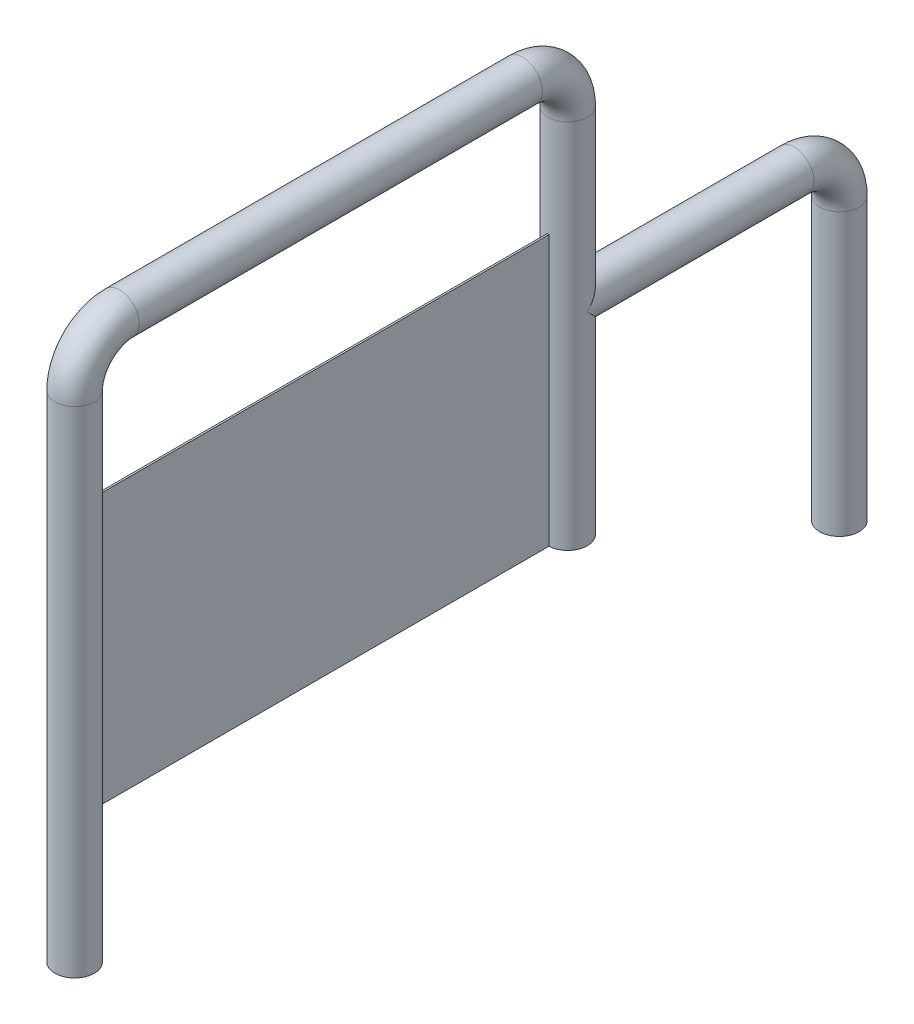
ISO-10303-21;
HEADER;
FILE_DESCRIPTION(('STEP AP214'),'2;1');
FILE_NAME('part.step','',(''),(''),'','','');
FILE_SCHEMA(('AUTOMOTIVE_DESIGN { 1 0 10303 214 1 1 1 1 }'));
ENDSEC;
DATA;
#1=APPLICATION_CONTEXT('core data for automotive mechanical design processes');
#2=APPLICATION_PROTOCOL_DEFINITION('international standard','automotive_design',2000,#1);
#3=PRODUCT_CONTEXT('',#1,'mechanical');
#4=PRODUCT('Part','Part','',(#3));
#5=PRODUCT_RELATED_PRODUCT_CATEGORY('part','',(#4));
#6=PRODUCT_DEFINITION_FORMATION('','',#4);
#7=PRODUCT_DEFINITION_CONTEXT('part definition',#1,'design');
#8=PRODUCT_DEFINITION('design','',#6,#7);
#9=PRODUCT_DEFINITION_SHAPE('','',#8);
#10=(LENGTH_UNIT() NAMED_UNIT(*) SI_UNIT(.MILLI.,.METRE.));
#11=(NAMED_UNIT(*) PLANE_ANGLE_UNIT() SI_UNIT($,.RADIAN.));
#12=(NAMED_UNIT(*) SI_UNIT($,.STERADIAN.) SOLID_ANGLE_UNIT());
#13=UNCERTAINTY_MEASURE_WITH_UNIT(LENGTH_MEASURE(1.E-05),#10,'distance_accuracy_value','');
#14=(GEOMETRIC_REPRESENTATION_CONTEXT(3) GLOBAL_UNCERTAINTY_ASSIGNED_CONTEXT((#13)) GLOBAL_UNIT_ASSIGNED_CONTEXT((#10,
#11,#12)) REPRESENTATION_CONTEXT('',''));
#15=CARTESIAN_POINT('',(0.,0.,0.));
#16=DIRECTION('',(0.,0.,1.));
#17=DIRECTION('',(1.,0.,0.));
#18=AXIS2_PLACEMENT_3D('',#15,#16,#17);
#19=CARTESIAN_POINT('',(-0.508,222.25,-11.1125));
#20=DIRECTION('',(0.,0.,1.));
#21=DIRECTION('',(0.,-1.,0.));
#22=AXIS2_PLACEMENT_3D('',#19,#20,#21);
#23=PLANE('',#22);
#24=DIRECTION('',(1.,0.,0.));
#25=VECTOR('',#24,1.);
#26=CARTESIAN_POINT('',(-0.508,69.85,-11.1125));
#27=LINE('',#26,#25);
#28=CARTESIAN_POINT('',(-0.508,69.85,-11.1125));
#29=VERTEX_POINT('',#28);
#30=CARTESIAN_POINT('',(0.508,69.85,-11.1125));
#31=VERTEX_POINT('',#30);
#32=EDGE_CURVE('E58',#29,#31,#27,.T.);
#33=ORIENTED_EDGE('',*,*,#32,.T.);
#34=DIRECTION('',(0.,-1.,0.));
#35=VECTOR('',#34,1.);
#36=CARTESIAN_POINT('',(0.508,222.25,-11.1125));
#37=LINE('',#36,#35);
#38=CARTESIAN_POINT('',(0.508,222.25,-11.1125));
#39=VERTEX_POINT('',#38);
#40=EDGE_CURVE('E95',#39,#31,#37,.T.);
#41=ORIENTED_EDGE('',*,*,#40,.F.);
#42=DIRECTION('',(1.,0.,0.));
#43=VECTOR('',#42,1.);
#44=CARTESIAN_POINT('',(-0.508,222.25,-11.1125));
#45=LINE('',#44,#43);
#46=CARTESIAN_POINT('',(-0.508,222.25,-11.1125));
#47=VERTEX_POINT('',#46);
#48=EDGE_CURVE('E13',#47,#39,#45,.T.);
#49=ORIENTED_EDGE('',*,*,#48,.F.);
#50=DIRECTION('',(0.,-1.,0.));
#51=VECTOR('',#50,1.);
#52=CARTESIAN_POINT('',(-0.508,222.25,-11.1125));
#53=LINE('',#52,#51);
#54=EDGE_CURVE('E96',#47,#29,#53,.T.);
#55=ORIENTED_EDGE('',*,*,#54,.T.);
#56=EDGE_LOOP('',(#33,#41,#49,#55));
#57=FACE_BOUND('',#56,.T.);
#58=ADVANCED_FACE('F55',(#57),#23,.T.);
#59=CARTESIAN_POINT('',(-0.508,222.25,-11.1125));
#60=DIRECTION('',(0.,1.,0.));
#61=DIRECTION('',(0.,0.,1.));
#62=AXIS2_PLACEMENT_3D('',#59,#60,#61);
#63=PLANE('',#62);
#64=ORIENTED_EDGE('',*,*,#48,.T.);
#65=DIRECTION('',(0.,0.,1.));
#66=VECTOR('',#65,1.);
#67=CARTESIAN_POINT('',(0.508,222.25,-11.1125));
#68=LINE('',#67,#66);
#69=CARTESIAN_POINT('',(0.508,222.25,-267.2875));
#70=VERTEX_POINT('',#69);
#71=EDGE_CURVE('E112',#70,#39,#68,.T.);
#72=ORIENTED_EDGE('',*,*,#71,.F.);
#73=DIRECTION('',(1.,0.,0.));
#74=VECTOR('',#73,1.);
#75=CARTESIAN_POINT('',(-0.508,222.25,-267.2875));
#76=LINE('',#75,#74);
#77=CARTESIAN_POINT('',(-0.508,222.25,-267.2875));
#78=VERTEX_POINT('',#77);
#79=EDGE_CURVE('E63',#78,#70,#76,.T.);
#80=ORIENTED_EDGE('',*,*,#79,.F.);
#81=DIRECTION('',(0.,0.,1.));
#82=VECTOR('',#81,1.);
#83=CARTESIAN_POINT('',(-0.508,222.25,-11.1125));
#84=LINE('',#83,#82);
#85=EDGE_CURVE('E101',#78,#47,#84,.T.);
#86=ORIENTED_EDGE('',*,*,#85,.T.);
#87=EDGE_LOOP('',(#64,#72,#80,#86));
#88=FACE_BOUND('',#87,.T.);
#89=ADVANCED_FACE('F127',(#88),#63,.T.);
#90=CARTESIAN_POINT('',(-0.508,222.25,-267.2875));
#91=DIRECTION('',(0.,0.,-1.));
#92=DIRECTION('',(-1.,0.,0.));
#93=AXIS2_PLACEMENT_3D('',#90,#91,#92);
#94=PLANE('',#93);
#95=ORIENTED_EDGE('',*,*,#79,.T.);
#96=DIRECTION('',(0.,1.,0.));
#97=VECTOR('',#96,1.);
#98=CARTESIAN_POINT('',(0.508,222.25,-267.2875));
#99=LINE('',#98,#97);
#100=CARTESIAN_POINT('',(0.508,69.85,-267.2875));
#101=VERTEX_POINT('',#100);
#102=EDGE_CURVE('E108',#101,#70,#99,.T.);
#103=ORIENTED_EDGE('',*,*,#102,.F.);
#104=DIRECTION('',(1.,0.,0.));
#105=VECTOR('',#104,1.);
#106=CARTESIAN_POINT('',(-0.508,69.85,-267.2875));
#107=LINE('',#106,#105);
#108=CARTESIAN_POINT('',(-0.508,69.85,-267.2875));
#109=VERTEX_POINT('',#108);
#110=EDGE_CURVE('E100',#109,#101,#107,.T.);
#111=ORIENTED_EDGE('',*,*,#110,.F.);
#112=DIRECTION('',(0.,1.,0.));
#113=VECTOR('',#112,1.);
#114=CARTESIAN_POINT('',(-0.508,222.25,-267.2875));
#115=LINE('',#114,#113);
#116=EDGE_CURVE('E120',#109,#78,#115,.T.);
#117=ORIENTED_EDGE('',*,*,#116,.T.);
#118=EDGE_LOOP('',(#95,#103,#111,#117));
#119=FACE_BOUND('',#118,.T.);
#120=ADVANCED_FACE('F124',(#119),#94,.T.);
#121=CARTESIAN_POINT('',(-0.508,69.85,-11.1125));
#122=DIRECTION('',(0.,-1.,0.));
#123=DIRECTION('',(0.,0.,-1.));
#124=AXIS2_PLACEMENT_3D('',#121,#122,#123);
#125=PLANE('',#124);
#126=ORIENTED_EDGE('',*,*,#110,.T.);
#127=DIRECTION('',(0.,0.,-1.));
#128=VECTOR('',#127,1.);
#129=CARTESIAN_POINT('',(0.508,69.85,-11.1125));
#130=LINE('',#129,#128);
#131=EDGE_CURVE('E103',#31,#101,#130,.T.);
#132=ORIENTED_EDGE('',*,*,#131,.F.);
#133=ORIENTED_EDGE('',*,*,#32,.F.);
#134=DIRECTION('',(0.,0.,-1.));
#135=VECTOR('',#134,1.);
#136=CARTESIAN_POINT('',(-0.508,69.85,-11.1125));
#137=LINE('',#136,#135);
#138=EDGE_CURVE('E118',#29,#109,#137,.T.);
#139=ORIENTED_EDGE('',*,*,#138,.T.);
#140=EDGE_LOOP('',(#126,#132,#133,#139));
#141=FACE_BOUND('',#140,.T.);
#142=ADVANCED_FACE('F104',(#141),#125,.T.);
#143=CARTESIAN_POINT('',(-0.508,0.,0.));
#144=DIRECTION('',(1.,0.,0.));
#145=DIRECTION('',(0.,0.,-1.));
#146=AXIS2_PLACEMENT_3D('',#143,#144,#145);
#147=PLANE('',#146);
#148=ORIENTED_EDGE('',*,*,#54,.F.);
#149=ORIENTED_EDGE('',*,*,#85,.F.);
#150=ORIENTED_EDGE('',*,*,#116,.F.);
#151=ORIENTED_EDGE('',*,*,#138,.F.);
#152=EDGE_LOOP('',(#148,#149,#150,#151));
#153=FACE_BOUND('',#152,.T.);
#154=ADVANCED_FACE('F129',(#153),#147,.F.);
#155=CARTESIAN_POINT('',(0.508,0.,0.));
#156=DIRECTION('',(1.,0.,0.));
#157=DIRECTION('',(0.,0.,-1.));
#158=AXIS2_PLACEMENT_3D('',#155,#156,#157);
#159=PLANE('',#158);
#160=ORIENTED_EDGE('',*,*,#40,.T.);
#161=ORIENTED_EDGE('',*,*,#131,.T.);
#162=ORIENTED_EDGE('',*,*,#102,.T.);
#163=ORIENTED_EDGE('',*,*,#71,.T.);
#164=EDGE_LOOP('',(#160,#161,#162,#163));
#165=FACE_BOUND('',#164,.T.);
#166=ADVANCED_FACE('F111',(#165),#159,.T.);
#167=CLOSED_SHELL('',(#58,#89,#120,#142,#154,#166));
#168=MANIFOLD_SOLID_BREP('B2',#167);
#169=CARTESIAN_POINT('',(0.,1.66533453693773E-13,-431.8));
#170=DIRECTION('',(0.,-1.,0.));
#171=DIRECTION('',(0.,0.,-1.));
#172=AXIS2_PLACEMENT_3D('',#169,#170,#171);
#173=PLANE('',#172);
#174=CARTESIAN_POINT('',(0.,1.66533453693773E-13,-431.8));
#175=DIRECTION('',(0.,-1.,0.));
#176=DIRECTION('',(0.,0.,-1.));
#177=AXIS2_PLACEMENT_3D('',#174,#175,#176);
#178=CIRCLE('',#177,11.1125);
#179=CARTESIAN_POINT('',(0.,1.65853009315997E-13,-442.9125));
#180=VERTEX_POINT('',#179);
#181=EDGE_CURVE('E216',#180,#180,#178,.T.);
#182=ORIENTED_EDGE('',*,*,#181,.T.);
#183=EDGE_LOOP('',(#182));
#184=FACE_BOUND('',#183,.T.);
#185=ADVANCED_FACE('F185',(#184),#173,.T.);
#186=CARTESIAN_POINT('',(0.,0.,0.));
#187=DIRECTION('',(0.,1.,0.));
#188=DIRECTION('',(0.,0.,1.));
#189=AXIS2_PLACEMENT_3D('',#186,#187,#188);
#190=PLANE('',#189);
#191=CARTESIAN_POINT('',(0.,0.,0.));
#192=DIRECTION('',(0.,1.,0.));
#193=DIRECTION('',(0.,0.,1.));
#194=AXIS2_PLACEMENT_3D('',#191,#192,#193);
#195=CIRCLE('',#194,11.1125);
#196=CARTESIAN_POINT('',(0.,0.,11.1125));
#197=VERTEX_POINT('',#196);
#198=EDGE_CURVE('E192',#197,#197,#195,.T.);
#199=ORIENTED_EDGE('',*,*,#198,.F.);
#200=EDGE_LOOP('',(#199));
#201=FACE_BOUND('',#200,.T.);
#202=ADVANCED_FACE('F241',(#201),#190,.F.);
#203=CARTESIAN_POINT('',(0.,184.15,-266.07625));
#204=DIRECTION('',(0.,0.,-1.));
#205=DIRECTION('',(-1.,0.,0.));
#206=AXIS2_PLACEMENT_3D('',#203,#204,#205);
#207=CYLINDRICAL_SURFACE('',#206,11.1125);
#208=CARTESIAN_POINT('',(0.,184.15,-278.4));
#209=DIRECTION('',(0.,0.707106781186547,-0.707106781186547));
#210=DIRECTION('',(0.,-0.707106781186547,-0.707106781186547));
#211=AXIS2_PLACEMENT_3D('',#208,#209,#210);
#212=ELLIPSE('',#211,15.715448211871,11.1125);
#213=CARTESIAN_POINT('',(-11.1125,184.15,-278.4));
#214=VERTEX_POINT('',#213);
#215=CARTESIAN_POINT('',(11.1125,184.15,-278.4));
#216=VERTEX_POINT('',#215);
#217=EDGE_CURVE('E53',#214,#216,#212,.F.);
#218=ORIENTED_EDGE('',*,*,#217,.F.);
#219=CARTESIAN_POINT('',(0.,184.15,-278.4));
#220=DIRECTION('',(0.,-0.707106781186548,-0.707106781186548));
#221=DIRECTION('',(0.,-0.707106781186548,0.707106781186548));
#222=AXIS2_PLACEMENT_3D('',#219,#220,#221);
#223=ELLIPSE('',#222,15.715448211871,11.1125);
#224=EDGE_CURVE('E198',#216,#214,#223,.F.);
#225=ORIENTED_EDGE('',*,*,#224,.F.);
#226=EDGE_LOOP('',(#218,#225));
#227=FACE_BOUND('',#226,.T.);
#228=CARTESIAN_POINT('',(0.,184.15,-406.4));
#229=DIRECTION('',(0.,0.,-1.));
#230=DIRECTION('',(0.,1.,0.));
#231=AXIS2_PLACEMENT_3D('',#228,#229,#230);
#232=CIRCLE('',#231,11.1125);
#233=CARTESIAN_POINT('',(0.,195.2625,-406.4));
#234=VERTEX_POINT('',#233);
#235=EDGE_CURVE('E203',#234,#234,#232,.T.);
#236=ORIENTED_EDGE('',*,*,#235,.F.);
#237=EDGE_LOOP('',(#236));
#238=FACE_BOUND('',#237,.T.);
#239=ADVANCED_FACE('F199',(#227,#238),#207,.T.);
#240=CARTESIAN_POINT('',(0.,158.75,-406.4));
#241=DIRECTION('',(-1.,0.,0.));
#242=DIRECTION('',(0.,0.,1.));
#243=AXIS2_PLACEMENT_3D('',#240,#241,#242);
#244=TOROIDAL_SURFACE('',#243,25.3999999999999,11.1125);
#245=CARTESIAN_POINT('',(0.,158.75,-431.8));
#246=DIRECTION('',(0.,-1.,0.));
#247=DIRECTION('',(0.,0.,-1.));
#248=AXIS2_PLACEMENT_3D('',#245,#246,#247);
#249=CIRCLE('',#248,11.1125);
#250=CARTESIAN_POINT('',(0.,158.75,-442.9125));
#251=VERTEX_POINT('',#250);
#252=EDGE_CURVE('E219',#251,#251,#249,.T.);
#253=CARTESIAN_POINT('',(0.,158.75,-406.4));
#254=DIRECTION('',(-1.,0.,0.));
#255=DIRECTION('',(0.,0.,1.));
#256=AXIS2_PLACEMENT_3D('',#253,#254,#255);
#257=CIRCLE('',#256,36.5125);
#258=EDGE_CURVE('',#234,#251,#257,.T.);
#259=ORIENTED_EDGE('',*,*,#235,.T.);
#260=ORIENTED_EDGE('',*,*,#252,.F.);
#261=ORIENTED_EDGE('',*,*,#258,.T.);
#262=ORIENTED_EDGE('',*,*,#258,.F.);
#263=EDGE_LOOP('',(#259,#261,#260,#262));
#264=FACE_BOUND('',#263,.T.);
#265=ADVANCED_FACE('F239',(#264),#244,.T.);
#266=CARTESIAN_POINT('',(0.,158.75,-431.8));
#267=DIRECTION('',(0.,-1.,0.));
#268=DIRECTION('',(0.,0.,-1.));
#269=AXIS2_PLACEMENT_3D('',#266,#267,#268);
#270=CYLINDRICAL_SURFACE('',#269,11.1125);
#271=ORIENTED_EDGE('',*,*,#181,.F.);
#272=EDGE_LOOP('',(#271));
#273=FACE_BOUND('',#272,.T.);
#274=ORIENTED_EDGE('',*,*,#252,.T.);
#275=EDGE_LOOP('',(#274));
#276=FACE_BOUND('',#275,.T.);
#277=ADVANCED_FACE('F247',(#273,#276),#270,.T.);
#278=CARTESIAN_POINT('',(0.,0.,0.));
#279=DIRECTION('',(0.,1.,0.));
#280=DIRECTION('',(0.,0.,1.));
#281=AXIS2_PLACEMENT_3D('',#278,#279,#280);
#282=CYLINDRICAL_SURFACE('',#281,11.1125);
#283=CARTESIAN_POINT('',(0.,279.4,0.));
#284=DIRECTION('',(0.,1.,0.));
#285=DIRECTION('',(0.,0.,1.));
#286=AXIS2_PLACEMENT_3D('',#283,#284,#285);
#287=CIRCLE('',#286,11.1125);
#288=CARTESIAN_POINT('',(0.,279.4,11.1125));
#289=VERTEX_POINT('',#288);
#290=EDGE_CURVE('E230',#289,#289,#287,.T.);
#291=ORIENTED_EDGE('',*,*,#290,.F.);
#292=EDGE_LOOP('',(#291));
#293=FACE_BOUND('',#292,.T.);
#294=ORIENTED_EDGE('',*,*,#198,.T.);
#295=EDGE_LOOP('',(#294));
#296=FACE_BOUND('',#295,.T.);
#297=ADVANCED_FACE('F253',(#293,#296),#282,.T.);
#298=CARTESIAN_POINT('',(0.,279.4,-25.4));
#299=DIRECTION('',(-1.,0.,0.));
#300=DIRECTION('',(0.,0.,1.));
#301=AXIS2_PLACEMENT_3D('',#298,#299,#300);
#302=TOROIDAL_SURFACE('',#301,25.4,11.1125);
#303=CARTESIAN_POINT('',(0.,304.8,-25.4));
#304=DIRECTION('',(0.,0.,-1.));
#305=DIRECTION('',(0.,1.,0.));
#306=AXIS2_PLACEMENT_3D('',#303,#304,#305);
#307=CIRCLE('',#306,11.1125);
#308=CARTESIAN_POINT('',(0.,315.9125,-25.4));
#309=VERTEX_POINT('',#308);
#310=EDGE_CURVE('E227',#309,#309,#307,.T.);
#311=CARTESIAN_POINT('',(0.,279.4,-25.4));
#312=DIRECTION('',(-1.,0.,0.));
#313=DIRECTION('',(0.,0.,1.));
#314=AXIS2_PLACEMENT_3D('',#311,#312,#313);
#315=CIRCLE('',#314,36.5125);
#316=EDGE_CURVE('',#289,#309,#315,.T.);
#317=ORIENTED_EDGE('',*,*,#290,.T.);
#318=ORIENTED_EDGE('',*,*,#310,.F.);
#319=ORIENTED_EDGE('',*,*,#316,.T.);
#320=ORIENTED_EDGE('',*,*,#316,.F.);
#321=EDGE_LOOP('',(#317,#319,#318,#320));
#322=FACE_BOUND('',#321,.T.);
#323=ADVANCED_FACE('F258',(#322),#302,.T.);
#324=CARTESIAN_POINT('',(0.,304.8,-25.4));
#325=DIRECTION('',(0.,0.,-1.));
#326=DIRECTION('',(0.,1.,0.));
#327=AXIS2_PLACEMENT_3D('',#324,#325,#326);
#328=CYLINDRICAL_SURFACE('',#327,11.1125);
#329=CARTESIAN_POINT('',(0.,304.8,-253.));
#330=DIRECTION('',(0.,0.,-1.));
#331=DIRECTION('',(0.,1.,0.));
#332=AXIS2_PLACEMENT_3D('',#329,#330,#331);
#333=CIRCLE('',#332,11.1125);
#334=CARTESIAN_POINT('',(0.,315.9125,-253.));
#335=VERTEX_POINT('',#334);
#336=EDGE_CURVE('E224',#335,#335,#333,.T.);
#337=ORIENTED_EDGE('',*,*,#336,.F.);
#338=EDGE_LOOP('',(#337));
#339=FACE_BOUND('',#338,.T.);
#340=ORIENTED_EDGE('',*,*,#310,.T.);
#341=EDGE_LOOP('',(#340));
#342=FACE_BOUND('',#341,.T.);
#343=ADVANCED_FACE('F262',(#339,#342),#328,.T.);
#344=CARTESIAN_POINT('',(0.,279.4,-253.));
#345=DIRECTION('',(-1.,0.,0.));
#346=DIRECTION('',(0.,0.,1.));
#347=AXIS2_PLACEMENT_3D('',#344,#345,#346);
#348=TOROIDAL_SURFACE('',#347,25.4,11.1125);
#349=CARTESIAN_POINT('',(0.,279.4,-278.4));
#350=DIRECTION('',(0.,-1.,0.));
#351=DIRECTION('',(0.,0.,-1.));
#352=AXIS2_PLACEMENT_3D('',#349,#350,#351);
#353=CIRCLE('',#352,11.1125);
#354=CARTESIAN_POINT('',(0.,279.4,-289.5125));
#355=VERTEX_POINT('',#354);
#356=EDGE_CURVE('E202',#355,#355,#353,.T.);
#357=CARTESIAN_POINT('',(0.,279.4,-253.));
#358=DIRECTION('',(-1.,0.,0.));
#359=DIRECTION('',(0.,0.,1.));
#360=AXIS2_PLACEMENT_3D('',#357,#358,#359);
#361=CIRCLE('',#360,36.5125);
#362=EDGE_CURVE('',#335,#355,#361,.T.);
#363=ORIENTED_EDGE('',*,*,#336,.T.);
#364=ORIENTED_EDGE('',*,*,#356,.F.);
#365=ORIENTED_EDGE('',*,*,#362,.T.);
#366=ORIENTED_EDGE('',*,*,#362,.F.);
#367=EDGE_LOOP('',(#363,#365,#364,#366));
#368=FACE_BOUND('',#367,.T.);
#369=ADVANCED_FACE('F209',(#368),#348,.T.);
#370=CARTESIAN_POINT('',(0.,279.4,-278.4));
#371=DIRECTION('',(0.,-1.,0.));
#372=DIRECTION('',(0.,0.,-1.));
#373=AXIS2_PLACEMENT_3D('',#370,#371,#372);
#374=CYLINDRICAL_SURFACE('',#373,11.1125);
#375=ORIENTED_EDGE('',*,*,#356,.T.);
#376=EDGE_LOOP('',(#375));
#377=FACE_BOUND('',#376,.T.);
#378=ORIENTED_EDGE('',*,*,#224,.T.);
#379=ORIENTED_EDGE('',*,*,#217,.T.);
#380=EDGE_LOOP('',(#378,#379));
#381=FACE_BOUND('',#380,.T.);
#382=CARTESIAN_POINT('',(0.,69.85,-278.4));
#383=DIRECTION('',(0.,-1.,0.));
#384=DIRECTION('',(0.,0.,-1.));
#385=AXIS2_PLACEMENT_3D('',#382,#383,#384);
#386=CIRCLE('',#385,11.1125);
#387=CARTESIAN_POINT('',(0.,69.85,-289.5125));
#388=VERTEX_POINT('',#387);
#389=EDGE_CURVE('E214',#388,#388,#386,.T.);
#390=ORIENTED_EDGE('',*,*,#389,.F.);
#391=EDGE_LOOP('',(#390));
#392=FACE_BOUND('',#391,.T.);
#393=ADVANCED_FACE('F205',(#377,#381,#392),#374,.T.);
#394=CARTESIAN_POINT('',(0.,69.85,-278.4));
#395=DIRECTION('',(0.,-1.,0.));
#396=DIRECTION('',(0.,0.,-1.));
#397=AXIS2_PLACEMENT_3D('',#394,#395,#396);
#398=PLANE('',#397);
#399=ORIENTED_EDGE('',*,*,#389,.T.);
#400=EDGE_LOOP('',(#399));
#401=FACE_BOUND('',#400,.T.);
#402=ADVANCED_FACE('F208',(#401),#398,.T.);
#403=CLOSED_SHELL('',(#185,#202,#239,#265,#277,#297,#323,#343,#369,#393,#402));
#404=MANIFOLD_SOLID_BREP('B7',#403);
#405=ADVANCED_BREP_SHAPE_REPRESENTATION('',(#18,#168,#404),#14);
#406=SHAPE_DEFINITION_REPRESENTATION(#9,#405);
ENDSEC;
END-ISO-10303-21;
